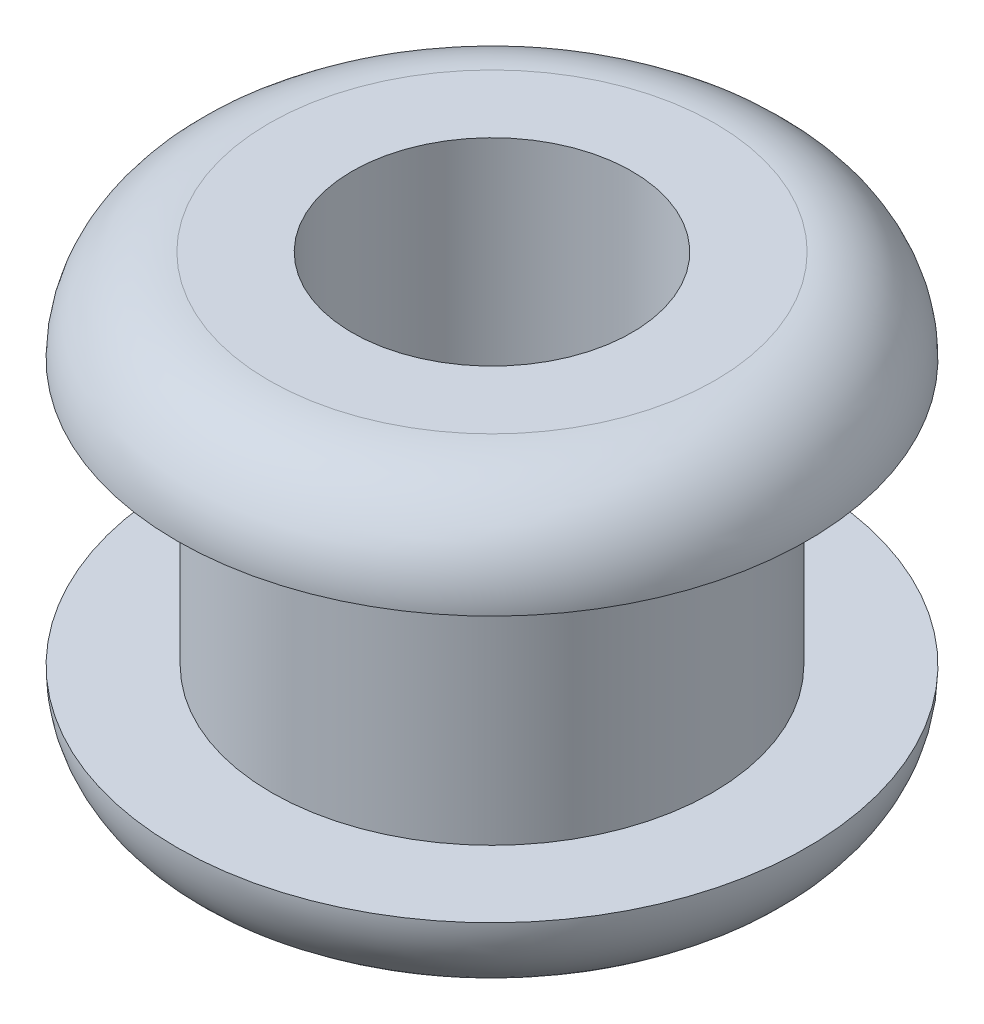
ISO-10303-21;
HEADER;
FILE_DESCRIPTION(('STEP AP214'),'2;1');
FILE_NAME('part.step','',(''),(''),'','','');
FILE_SCHEMA(('AUTOMOTIVE_DESIGN { 1 0 10303 214 1 1 1 1 }'));
ENDSEC;
DATA;
#1=APPLICATION_CONTEXT('core data for automotive mechanical design processes');
#2=APPLICATION_PROTOCOL_DEFINITION('international standard','automotive_design',2000,#1);
#3=PRODUCT_CONTEXT('',#1,'mechanical');
#4=PRODUCT('Part','Part','',(#3));
#5=PRODUCT_RELATED_PRODUCT_CATEGORY('part','',(#4));
#6=PRODUCT_DEFINITION_FORMATION('','',#4);
#7=PRODUCT_DEFINITION_CONTEXT('part definition',#1,'design');
#8=PRODUCT_DEFINITION('design','',#6,#7);
#9=PRODUCT_DEFINITION_SHAPE('','',#8);
#10=(LENGTH_UNIT() NAMED_UNIT(*) SI_UNIT(.MILLI.,.METRE.));
#11=(NAMED_UNIT(*) PLANE_ANGLE_UNIT() SI_UNIT($,.RADIAN.));
#12=(NAMED_UNIT(*) SI_UNIT($,.STERADIAN.) SOLID_ANGLE_UNIT());
#13=UNCERTAINTY_MEASURE_WITH_UNIT(LENGTH_MEASURE(1.E-05),#10,'distance_accuracy_value','');
#14=(GEOMETRIC_REPRESENTATION_CONTEXT(3) GLOBAL_UNCERTAINTY_ASSIGNED_CONTEXT((#13)) GLOBAL_UNIT_ASSIGNED_CONTEXT((#10,
#11,#12)) REPRESENTATION_CONTEXT('',''));
#15=CARTESIAN_POINT('',(0.,0.,0.));
#16=DIRECTION('',(0.,0.,1.));
#17=DIRECTION('',(1.,0.,0.));
#18=AXIS2_PLACEMENT_3D('',#15,#16,#17);
#19=CARTESIAN_POINT('',(2.35,2.375,0.));
#20=DIRECTION('',(0.,1.,0.));
#21=DIRECTION('',(1.,0.,0.));
#22=AXIS2_PLACEMENT_3D('',#19,#20,#21);
#23=PLANE('',#22);
#24=CARTESIAN_POINT('',(0.,2.375,0.));
#25=DIRECTION('',(0.,-1.,0.));
#26=DIRECTION('',(1.,0.,0.));
#27=AXIS2_PLACEMENT_3D('',#24,#25,#26);
#28=CIRCLE('',#27,1.475);
#29=CARTESIAN_POINT('',(-1.475,2.375,0.));
#30=VERTEX_POINT('',#29);
#31=EDGE_CURVE('E13',#30,#30,#28,.T.);
#32=ORIENTED_EDGE('',*,*,#31,.T.);
#33=EDGE_LOOP('',(#32));
#34=FACE_BOUND('',#33,.T.);
#35=CARTESIAN_POINT('',(0.,2.375,0.));
#36=DIRECTION('',(0.,-1.,0.));
#37=DIRECTION('',(1.,0.,0.));
#38=AXIS2_PLACEMENT_3D('',#35,#36,#37);
#39=CIRCLE('',#38,2.35);
#40=CARTESIAN_POINT('',(0.,2.375,2.35));
#41=VERTEX_POINT('',#40);
#42=EDGE_CURVE('E28',#41,#41,#39,.T.);
#43=ORIENTED_EDGE('',*,*,#42,.F.);
#44=EDGE_LOOP('',(#43));
#45=FACE_BOUND('',#44,.T.);
#46=ADVANCED_FACE('F24',(#34,#45),#23,.T.);
#47=CARTESIAN_POINT('',(0.,0.,0.));
#48=DIRECTION('',(0.,-1.,0.));
#49=DIRECTION('',(1.,0.,0.));
#50=AXIS2_PLACEMENT_3D('',#47,#48,#49);
#51=CYLINDRICAL_SURFACE('',#50,1.475);
#52=CARTESIAN_POINT('',(0.,-2.375,0.));
#53=DIRECTION('',(0.,-1.,0.));
#54=DIRECTION('',(1.,0.,0.));
#55=AXIS2_PLACEMENT_3D('',#52,#53,#54);
#56=CIRCLE('',#55,1.475);
#57=CARTESIAN_POINT('',(-1.475,-2.375,0.));
#58=VERTEX_POINT('',#57);
#59=EDGE_CURVE('E103',#58,#58,#56,.T.);
#60=ORIENTED_EDGE('',*,*,#59,.T.);
#61=DIRECTION('',(0.,1.,0.));
#62=VECTOR('',#61,1.);
#63=CARTESIAN_POINT('',(-1.475,0.,0.));
#64=LINE('',#63,#62);
#65=EDGE_CURVE('E35',#58,#30,#64,.T.);
#66=ORIENTED_EDGE('',*,*,#65,.T.);
#67=ORIENTED_EDGE('',*,*,#31,.F.);
#68=ORIENTED_EDGE('',*,*,#65,.F.);
#69=EDGE_LOOP('',(#60,#66,#67,#68));
#70=FACE_BOUND('',#69,.T.);
#71=ADVANCED_FACE('F118',(#70),#51,.F.);
#72=CARTESIAN_POINT('',(1.475,-2.375,0.));
#73=DIRECTION('',(0.,-1.,0.));
#74=DIRECTION('',(0.,0.,-1.));
#75=AXIS2_PLACEMENT_3D('',#72,#73,#74);
#76=PLANE('',#75);
#77=ORIENTED_EDGE('',*,*,#59,.F.);
#78=EDGE_LOOP('',(#77));
#79=FACE_BOUND('',#78,.T.);
#80=CARTESIAN_POINT('',(0.,-2.375,0.));
#81=DIRECTION('',(0.,-1.,0.));
#82=DIRECTION('',(1.,0.,0.));
#83=AXIS2_PLACEMENT_3D('',#80,#81,#82);
#84=CIRCLE('',#83,2.35);
#85=CARTESIAN_POINT('',(0.,-2.375,2.35));
#86=VERTEX_POINT('',#85);
#87=EDGE_CURVE('E104',#86,#86,#84,.T.);
#88=ORIENTED_EDGE('',*,*,#87,.T.);
#89=EDGE_LOOP('',(#88));
#90=FACE_BOUND('',#89,.T.);
#91=ADVANCED_FACE('F26',(#79,#90),#76,.T.);
#92=CARTESIAN_POINT('',(0.,-1.4,0.));
#93=DIRECTION('',(0.,-1.,0.));
#94=DIRECTION('',(0.,0.,-1.));
#95=AXIS2_PLACEMENT_3D('',#92,#93,#94);
#96=TOROIDAL_SURFACE('',#95,2.35,0.975);
#97=ORIENTED_EDGE('',*,*,#87,.F.);
#98=CARTESIAN_POINT('',(0.,-1.4,2.35));
#99=DIRECTION('',(-1.,0.,0.));
#100=DIRECTION('',(0.,0.,1.));
#101=AXIS2_PLACEMENT_3D('',#98,#99,#100);
#102=CIRCLE('',#101,0.975);
#103=CARTESIAN_POINT('',(0.,-1.4,3.325));
#104=VERTEX_POINT('',#103);
#105=EDGE_CURVE('E99',#86,#104,#102,.T.);
#106=ORIENTED_EDGE('',*,*,#105,.T.);
#107=CARTESIAN_POINT('',(0.,-1.4,0.));
#108=DIRECTION('',(0.,-1.,0.));
#109=DIRECTION('',(1.,0.,0.));
#110=AXIS2_PLACEMENT_3D('',#107,#108,#109);
#111=CIRCLE('',#110,3.325);
#112=EDGE_CURVE('E93',#104,#104,#111,.T.);
#113=ORIENTED_EDGE('',*,*,#112,.T.);
#114=ORIENTED_EDGE('',*,*,#105,.F.);
#115=EDGE_LOOP('',(#97,#106,#113,#114));
#116=FACE_BOUND('',#115,.T.);
#117=ADVANCED_FACE('F122',(#116),#96,.T.);
#118=CARTESIAN_POINT('',(3.325,-1.4,0.));
#119=DIRECTION('',(0.,1.,0.));
#120=DIRECTION('',(1.,0.,0.));
#121=AXIS2_PLACEMENT_3D('',#118,#119,#120);
#122=PLANE('',#121);
#123=CARTESIAN_POINT('',(0.,-1.4,0.));
#124=DIRECTION('',(0.,-1.,0.));
#125=DIRECTION('',(1.,0.,0.));
#126=AXIS2_PLACEMENT_3D('',#123,#124,#125);
#127=CIRCLE('',#126,2.325);
#128=CARTESIAN_POINT('',(-2.325,-1.4,0.));
#129=VERTEX_POINT('',#128);
#130=EDGE_CURVE('E94',#129,#129,#127,.T.);
#131=ORIENTED_EDGE('',*,*,#130,.T.);
#132=EDGE_LOOP('',(#131));
#133=FACE_BOUND('',#132,.T.);
#134=ORIENTED_EDGE('',*,*,#112,.F.);
#135=EDGE_LOOP('',(#134));
#136=FACE_BOUND('',#135,.T.);
#137=ADVANCED_FACE('F175',(#133,#136),#122,.T.);
#138=CARTESIAN_POINT('',(0.,0.,0.));
#139=DIRECTION('',(0.,-1.,0.));
#140=DIRECTION('',(1.,0.,0.));
#141=AXIS2_PLACEMENT_3D('',#138,#139,#140);
#142=CYLINDRICAL_SURFACE('',#141,2.325);
#143=ORIENTED_EDGE('',*,*,#130,.F.);
#144=DIRECTION('',(0.,1.,0.));
#145=VECTOR('',#144,1.);
#146=CARTESIAN_POINT('',(-2.325,0.,0.));
#147=LINE('',#146,#145);
#148=CARTESIAN_POINT('',(-2.325,1.4,0.));
#149=VERTEX_POINT('',#148);
#150=EDGE_CURVE('E62',#129,#149,#147,.T.);
#151=ORIENTED_EDGE('',*,*,#150,.T.);
#152=CARTESIAN_POINT('',(0.,1.4,0.));
#153=DIRECTION('',(0.,-1.,0.));
#154=DIRECTION('',(1.,0.,0.));
#155=AXIS2_PLACEMENT_3D('',#152,#153,#154);
#156=CIRCLE('',#155,2.325);
#157=EDGE_CURVE('E98',#149,#149,#156,.T.);
#158=ORIENTED_EDGE('',*,*,#157,.T.);
#159=ORIENTED_EDGE('',*,*,#150,.F.);
#160=EDGE_LOOP('',(#143,#151,#158,#159));
#161=FACE_BOUND('',#160,.T.);
#162=ADVANCED_FACE('F184',(#161),#142,.T.);
#163=CARTESIAN_POINT('',(2.325,1.4,0.));
#164=DIRECTION('',(0.,-1.,0.));
#165=DIRECTION('',(0.,0.,-1.));
#166=AXIS2_PLACEMENT_3D('',#163,#164,#165);
#167=PLANE('',#166);
#168=ORIENTED_EDGE('',*,*,#157,.F.);
#169=EDGE_LOOP('',(#168));
#170=FACE_BOUND('',#169,.T.);
#171=CARTESIAN_POINT('',(0.,1.4,0.));
#172=DIRECTION('',(0.,-1.,0.));
#173=DIRECTION('',(1.,0.,0.));
#174=AXIS2_PLACEMENT_3D('',#171,#172,#173);
#175=CIRCLE('',#174,3.325);
#176=CARTESIAN_POINT('',(0.,1.4,3.325));
#177=VERTEX_POINT('',#176);
#178=EDGE_CURVE('E79',#177,#177,#175,.T.);
#179=ORIENTED_EDGE('',*,*,#178,.T.);
#180=EDGE_LOOP('',(#179));
#181=FACE_BOUND('',#180,.T.);
#182=ADVANCED_FACE('F83',(#170,#181),#167,.T.);
#183=CARTESIAN_POINT('',(0.,1.4,0.));
#184=DIRECTION('',(0.,-1.,0.));
#185=DIRECTION('',(0.,0.,-1.));
#186=AXIS2_PLACEMENT_3D('',#183,#184,#185);
#187=TOROIDAL_SURFACE('',#186,2.35,0.975);
#188=ORIENTED_EDGE('',*,*,#178,.F.);
#189=CARTESIAN_POINT('',(0.,1.4,2.35));
#190=DIRECTION('',(-1.,0.,0.));
#191=DIRECTION('',(0.,0.,1.));
#192=AXIS2_PLACEMENT_3D('',#189,#190,#191);
#193=CIRCLE('',#192,0.975);
#194=EDGE_CURVE('E76',#177,#41,#193,.T.);
#195=ORIENTED_EDGE('',*,*,#194,.T.);
#196=ORIENTED_EDGE('',*,*,#42,.T.);
#197=ORIENTED_EDGE('',*,*,#194,.F.);
#198=EDGE_LOOP('',(#188,#195,#196,#197));
#199=FACE_BOUND('',#198,.T.);
#200=ADVANCED_FACE('F78',(#199),#187,.T.);
#201=CLOSED_SHELL('',(#46,#71,#91,#117,#137,#162,#182,#200));
#202=MANIFOLD_SOLID_BREP('B1',#201);
#203=ADVANCED_BREP_SHAPE_REPRESENTATION('',(#18,#202),#14);
#204=SHAPE_DEFINITION_REPRESENTATION(#9,#203);
ENDSEC;
END-ISO-10303-21;
